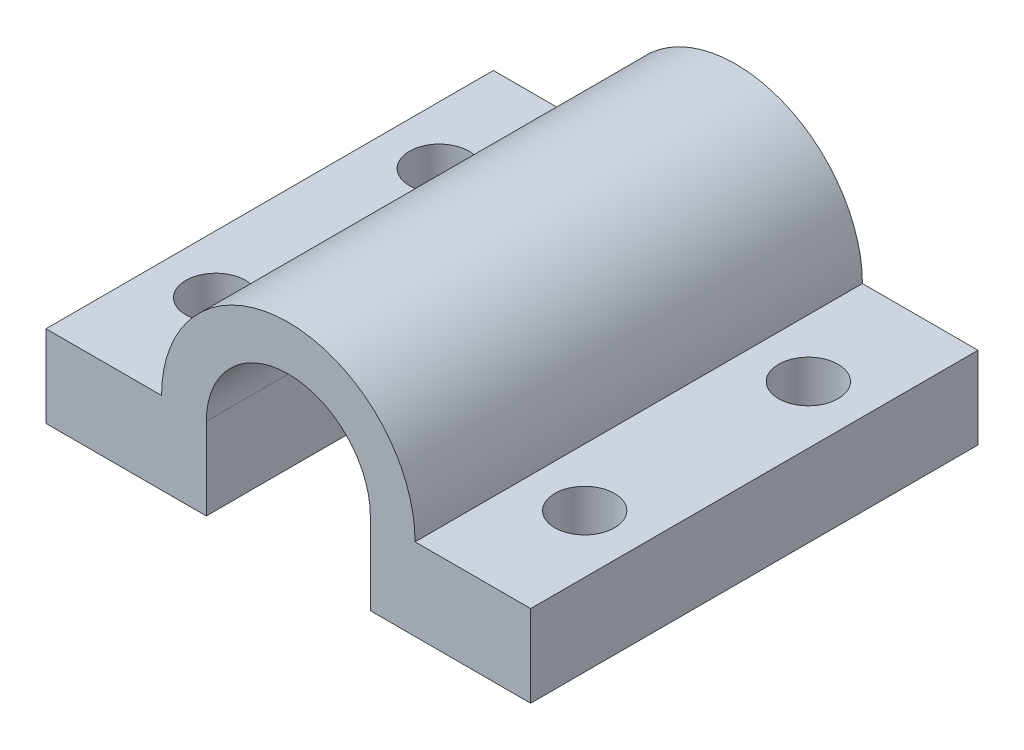
ISO-10303-21;
HEADER;
FILE_DESCRIPTION(('STEP AP214'),'2;1');
FILE_NAME('part.step','',(''),(''),'','','');
FILE_SCHEMA(('AUTOMOTIVE_DESIGN { 1 0 10303 214 1 1 1 1 }'));
ENDSEC;
DATA;
#1=APPLICATION_CONTEXT('core data for automotive mechanical design processes');
#2=APPLICATION_PROTOCOL_DEFINITION('international standard','automotive_design',2000,#1);
#3=PRODUCT_CONTEXT('',#1,'mechanical');
#4=PRODUCT('Part','Part','',(#3));
#5=PRODUCT_RELATED_PRODUCT_CATEGORY('part','',(#4));
#6=PRODUCT_DEFINITION_FORMATION('','',#4);
#7=PRODUCT_DEFINITION_CONTEXT('part definition',#1,'design');
#8=PRODUCT_DEFINITION('design','',#6,#7);
#9=PRODUCT_DEFINITION_SHAPE('','',#8);
#10=(LENGTH_UNIT() NAMED_UNIT(*) SI_UNIT(.MILLI.,.METRE.));
#11=(NAMED_UNIT(*) PLANE_ANGLE_UNIT() SI_UNIT($,.RADIAN.));
#12=(NAMED_UNIT(*) SI_UNIT($,.STERADIAN.) SOLID_ANGLE_UNIT());
#13=UNCERTAINTY_MEASURE_WITH_UNIT(LENGTH_MEASURE(1.E-05),#10,'distance_accuracy_value','');
#14=(GEOMETRIC_REPRESENTATION_CONTEXT(3) GLOBAL_UNCERTAINTY_ASSIGNED_CONTEXT((#13)) GLOBAL_UNIT_ASSIGNED_CONTEXT((#10,
#11,#12)) REPRESENTATION_CONTEXT('',''));
#15=CARTESIAN_POINT('',(0.,0.,0.));
#16=DIRECTION('',(0.,0.,1.));
#17=DIRECTION('',(1.,0.,0.));
#18=AXIS2_PLACEMENT_3D('',#15,#16,#17);
#19=CARTESIAN_POINT('',(0.,0.,12.));
#20=DIRECTION('',(0.,0.,-1.));
#21=DIRECTION('',(-1.,0.,0.));
#22=AXIS2_PLACEMENT_3D('',#19,#20,#21);
#23=CYLINDRICAL_SURFACE('',#22,2.2);
#24=CARTESIAN_POINT('',(0.,0.,0.));
#25=DIRECTION('',(0.,0.,-1.));
#26=DIRECTION('',(-1.,0.,0.));
#27=AXIS2_PLACEMENT_3D('',#24,#25,#26);
#28=CIRCLE('',#27,2.2);
#29=CARTESIAN_POINT('',(-2.2,0.,0.));
#30=VERTEX_POINT('',#29);
#31=CARTESIAN_POINT('',(2.2,0.,0.));
#32=VERTEX_POINT('',#31);
#33=EDGE_CURVE('E143',#30,#32,#28,.T.);
#34=ORIENTED_EDGE('',*,*,#33,.T.);
#35=DIRECTION('',(0.,0.,-1.));
#36=VECTOR('',#35,1.);
#37=CARTESIAN_POINT('',(2.2,0.,12.));
#38=LINE('',#37,#36);
#39=CARTESIAN_POINT('',(2.2,0.,12.));
#40=VERTEX_POINT('',#39);
#41=EDGE_CURVE('E11',#40,#32,#38,.T.);
#42=ORIENTED_EDGE('',*,*,#41,.F.);
#43=CARTESIAN_POINT('',(0.,0.,12.));
#44=DIRECTION('',(0.,0.,-1.));
#45=DIRECTION('',(-1.,0.,0.));
#46=AXIS2_PLACEMENT_3D('',#43,#44,#45);
#47=CIRCLE('',#46,2.2);
#48=CARTESIAN_POINT('',(-2.2,0.,12.));
#49=VERTEX_POINT('',#48);
#50=EDGE_CURVE('E162',#49,#40,#47,.T.);
#51=ORIENTED_EDGE('',*,*,#50,.F.);
#52=DIRECTION('',(0.,0.,-1.));
#53=VECTOR('',#52,1.);
#54=CARTESIAN_POINT('',(-2.2,0.,12.));
#55=LINE('',#54,#53);
#56=EDGE_CURVE('E139',#49,#30,#55,.T.);
#57=ORIENTED_EDGE('',*,*,#56,.T.);
#58=EDGE_LOOP('',(#34,#42,#51,#57));
#59=FACE_BOUND('',#58,.T.);
#60=ADVANCED_FACE('F33',(#59),#23,.F.);
#61=CARTESIAN_POINT('',(2.2,0.,12.));
#62=DIRECTION('',(1.,0.,0.));
#63=DIRECTION('',(0.,1.,0.));
#64=AXIS2_PLACEMENT_3D('',#61,#62,#63);
#65=PLANE('',#64);
#66=DIRECTION('',(0.,-1.,0.));
#67=VECTOR('',#66,1.);
#68=CARTESIAN_POINT('',(2.2,0.,0.));
#69=LINE('',#68,#67);
#70=CARTESIAN_POINT('',(2.2,-2.2,0.));
#71=VERTEX_POINT('',#70);
#72=EDGE_CURVE('E146',#32,#71,#69,.T.);
#73=ORIENTED_EDGE('',*,*,#72,.T.);
#74=DIRECTION('',(0.,0.,-1.));
#75=VECTOR('',#74,1.);
#76=CARTESIAN_POINT('',(2.2,-2.2,12.));
#77=LINE('',#76,#75);
#78=CARTESIAN_POINT('',(2.2,-2.2,12.));
#79=VERTEX_POINT('',#78);
#80=EDGE_CURVE('E42',#79,#71,#77,.T.);
#81=ORIENTED_EDGE('',*,*,#80,.F.);
#82=DIRECTION('',(0.,-1.,0.));
#83=VECTOR('',#82,1.);
#84=CARTESIAN_POINT('',(2.2,0.,12.));
#85=LINE('',#84,#83);
#86=EDGE_CURVE('E100',#40,#79,#85,.T.);
#87=ORIENTED_EDGE('',*,*,#86,.F.);
#88=ORIENTED_EDGE('',*,*,#41,.T.);
#89=EDGE_LOOP('',(#73,#81,#87,#88));
#90=FACE_BOUND('',#89,.T.);
#91=ADVANCED_FACE('F238',(#90),#65,.F.);
#92=CARTESIAN_POINT('',(2.2,-2.2,12.));
#93=DIRECTION('',(0.,1.,0.));
#94=DIRECTION('',(-1.,0.,0.));
#95=AXIS2_PLACEMENT_3D('',#92,#93,#94);
#96=PLANE('',#95);
#97=CARTESIAN_POINT('',(4.95,-2.19999999999999,3.));
#98=DIRECTION('',(0.,1.,0.));
#99=DIRECTION('',(-1.,0.,0.));
#100=AXIS2_PLACEMENT_3D('',#97,#98,#99);
#101=CIRCLE('',#100,0.800000000000001);
#102=CARTESIAN_POINT('',(4.15,-2.2,3.));
#103=VERTEX_POINT('',#102);
#104=EDGE_CURVE('E147',#103,#103,#101,.T.);
#105=ORIENTED_EDGE('',*,*,#104,.T.);
#106=EDGE_LOOP('',(#105));
#107=FACE_BOUND('',#106,.T.);
#108=CARTESIAN_POINT('',(4.95,-2.19999999999999,9.));
#109=DIRECTION('',(0.,1.,0.));
#110=DIRECTION('',(-1.,0.,0.));
#111=AXIS2_PLACEMENT_3D('',#108,#109,#110);
#112=CIRCLE('',#111,0.800000000000001);
#113=CARTESIAN_POINT('',(4.15,-2.2,9.));
#114=VERTEX_POINT('',#113);
#115=EDGE_CURVE('E185',#114,#114,#112,.T.);
#116=ORIENTED_EDGE('',*,*,#115,.T.);
#117=EDGE_LOOP('',(#116));
#118=FACE_BOUND('',#117,.T.);
#119=DIRECTION('',(1.,0.,0.));
#120=VECTOR('',#119,1.);
#121=CARTESIAN_POINT('',(2.2,-2.2,0.));
#122=LINE('',#121,#120);
#123=CARTESIAN_POINT('',(6.50000000000001,-2.19999999999999,0.));
#124=VERTEX_POINT('',#123);
#125=EDGE_CURVE('E149',#71,#124,#122,.T.);
#126=ORIENTED_EDGE('',*,*,#125,.T.);
#127=DIRECTION('',(0.,0.,-1.));
#128=VECTOR('',#127,1.);
#129=CARTESIAN_POINT('',(6.50000000000001,-2.19999999999999,12.));
#130=LINE('',#129,#128);
#131=CARTESIAN_POINT('',(6.50000000000001,-2.19999999999999,12.));
#132=VERTEX_POINT('',#131);
#133=EDGE_CURVE('E175',#132,#124,#130,.T.);
#134=ORIENTED_EDGE('',*,*,#133,.F.);
#135=DIRECTION('',(1.,0.,0.));
#136=VECTOR('',#135,1.);
#137=CARTESIAN_POINT('',(2.2,-2.2,12.));
#138=LINE('',#137,#136);
#139=EDGE_CURVE('E202',#79,#132,#138,.T.);
#140=ORIENTED_EDGE('',*,*,#139,.F.);
#141=ORIENTED_EDGE('',*,*,#80,.T.);
#142=EDGE_LOOP('',(#126,#134,#140,#141));
#143=FACE_BOUND('',#142,.T.);
#144=ADVANCED_FACE('F242',(#107,#118,#143),#96,.F.);
#145=CARTESIAN_POINT('',(6.50000000000001,-2.19999999999999,12.));
#146=DIRECTION('',(-1.,0.,0.));
#147=DIRECTION('',(0.,0.,1.));
#148=AXIS2_PLACEMENT_3D('',#145,#146,#147);
#149=PLANE('',#148);
#150=DIRECTION('',(0.,1.,0.));
#151=VECTOR('',#150,1.);
#152=CARTESIAN_POINT('',(6.50000000000001,-2.19999999999999,0.));
#153=LINE('',#152,#151);
#154=CARTESIAN_POINT('',(6.50000000000001,0.,0.));
#155=VERTEX_POINT('',#154);
#156=EDGE_CURVE('E151',#124,#155,#153,.T.);
#157=ORIENTED_EDGE('',*,*,#156,.T.);
#158=DIRECTION('',(0.,0.,-1.));
#159=VECTOR('',#158,1.);
#160=CARTESIAN_POINT('',(6.50000000000001,0.,12.));
#161=LINE('',#160,#159);
#162=CARTESIAN_POINT('',(6.50000000000001,0.,12.));
#163=VERTEX_POINT('',#162);
#164=EDGE_CURVE('E172',#163,#155,#161,.T.);
#165=ORIENTED_EDGE('',*,*,#164,.F.);
#166=DIRECTION('',(0.,1.,0.));
#167=VECTOR('',#166,1.);
#168=CARTESIAN_POINT('',(6.50000000000001,-2.19999999999999,12.));
#169=LINE('',#168,#167);
#170=EDGE_CURVE('E204',#132,#163,#169,.T.);
#171=ORIENTED_EDGE('',*,*,#170,.F.);
#172=ORIENTED_EDGE('',*,*,#133,.T.);
#173=EDGE_LOOP('',(#157,#165,#171,#172));
#174=FACE_BOUND('',#173,.T.);
#175=ADVANCED_FACE('F246',(#174),#149,.F.);
#176=CARTESIAN_POINT('',(6.50000000000001,0.,12.));
#177=DIRECTION('',(0.,-1.,0.));
#178=DIRECTION('',(1.,0.,0.));
#179=AXIS2_PLACEMENT_3D('',#176,#177,#178);
#180=PLANE('',#179);
#181=CARTESIAN_POINT('',(4.95,0.,3.));
#182=DIRECTION('',(0.,1.,0.));
#183=DIRECTION('',(0.,0.,-1.));
#184=AXIS2_PLACEMENT_3D('',#181,#182,#183);
#185=CIRCLE('',#184,0.800000000000001);
#186=CARTESIAN_POINT('',(4.95,0.,2.2));
#187=VERTEX_POINT('',#186);
#188=EDGE_CURVE('E192',#187,#187,#185,.T.);
#189=ORIENTED_EDGE('',*,*,#188,.F.);
#190=EDGE_LOOP('',(#189));
#191=FACE_BOUND('',#190,.T.);
#192=CARTESIAN_POINT('',(4.95,0.,9.));
#193=DIRECTION('',(0.,1.,0.));
#194=DIRECTION('',(0.,0.,1.));
#195=AXIS2_PLACEMENT_3D('',#192,#193,#194);
#196=CIRCLE('',#195,0.800000000000001);
#197=CARTESIAN_POINT('',(4.95,0.,9.8));
#198=VERTEX_POINT('',#197);
#199=EDGE_CURVE('E384',#198,#198,#196,.T.);
#200=ORIENTED_EDGE('',*,*,#199,.F.);
#201=EDGE_LOOP('',(#200));
#202=FACE_BOUND('',#201,.T.);
#203=DIRECTION('',(-1.,0.,0.));
#204=VECTOR('',#203,1.);
#205=CARTESIAN_POINT('',(6.50000000000001,0.,0.));
#206=LINE('',#205,#204);
#207=CARTESIAN_POINT('',(3.40000000000001,0.,0.));
#208=VERTEX_POINT('',#207);
#209=EDGE_CURVE('E153',#155,#208,#206,.T.);
#210=ORIENTED_EDGE('',*,*,#209,.T.);
#211=DIRECTION('',(0.,0.,-1.));
#212=VECTOR('',#211,1.);
#213=CARTESIAN_POINT('',(3.40000000000001,0.,12.));
#214=LINE('',#213,#212);
#215=CARTESIAN_POINT('',(3.40000000000001,0.,12.));
#216=VERTEX_POINT('',#215);
#217=EDGE_CURVE('E169',#216,#208,#214,.T.);
#218=ORIENTED_EDGE('',*,*,#217,.F.);
#219=DIRECTION('',(-1.,0.,0.));
#220=VECTOR('',#219,1.);
#221=CARTESIAN_POINT('',(6.50000000000001,0.,12.));
#222=LINE('',#221,#220);
#223=EDGE_CURVE('E206',#163,#216,#222,.T.);
#224=ORIENTED_EDGE('',*,*,#223,.F.);
#225=ORIENTED_EDGE('',*,*,#164,.T.);
#226=EDGE_LOOP('',(#210,#218,#224,#225));
#227=FACE_BOUND('',#226,.T.);
#228=ADVANCED_FACE('F252',(#191,#202,#227),#180,.F.);
#229=CARTESIAN_POINT('',(0.,0.,12.));
#230=DIRECTION('',(0.,0.,-1.));
#231=DIRECTION('',(-1.,0.,0.));
#232=AXIS2_PLACEMENT_3D('',#229,#230,#231);
#233=CYLINDRICAL_SURFACE('',#232,3.40000000000001);
#234=CARTESIAN_POINT('',(0.,0.,0.));
#235=DIRECTION('',(0.,0.,1.));
#236=DIRECTION('',(-1.,0.,0.));
#237=AXIS2_PLACEMENT_3D('',#234,#235,#236);
#238=CIRCLE('',#237,3.40000000000001);
#239=CARTESIAN_POINT('',(-3.4,0.,0.));
#240=VERTEX_POINT('',#239);
#241=EDGE_CURVE('E155',#208,#240,#238,.T.);
#242=ORIENTED_EDGE('',*,*,#241,.T.);
#243=DIRECTION('',(0.,0.,-1.));
#244=VECTOR('',#243,1.);
#245=CARTESIAN_POINT('',(-3.4,0.,12.));
#246=LINE('',#245,#244);
#247=CARTESIAN_POINT('',(-3.4,0.,12.));
#248=VERTEX_POINT('',#247);
#249=EDGE_CURVE('E166',#248,#240,#246,.T.);
#250=ORIENTED_EDGE('',*,*,#249,.F.);
#251=CARTESIAN_POINT('',(0.,0.,12.));
#252=DIRECTION('',(0.,0.,1.));
#253=DIRECTION('',(-1.,0.,0.));
#254=AXIS2_PLACEMENT_3D('',#251,#252,#253);
#255=CIRCLE('',#254,3.40000000000001);
#256=EDGE_CURVE('E208',#216,#248,#255,.T.);
#257=ORIENTED_EDGE('',*,*,#256,.F.);
#258=ORIENTED_EDGE('',*,*,#217,.T.);
#259=EDGE_LOOP('',(#242,#250,#257,#258));
#260=FACE_BOUND('',#259,.T.);
#261=ADVANCED_FACE('F214',(#260),#233,.T.);
#262=CARTESIAN_POINT('',(-6.49999999999999,0.,12.));
#263=DIRECTION('',(0.,-1.,0.));
#264=DIRECTION('',(0.,0.,-1.));
#265=AXIS2_PLACEMENT_3D('',#262,#263,#264);
#266=PLANE('',#265);
#267=CARTESIAN_POINT('',(-4.95,0.,9.));
#268=DIRECTION('',(0.,1.,0.));
#269=DIRECTION('',(0.,0.,-1.));
#270=AXIS2_PLACEMENT_3D('',#267,#268,#269);
#271=CIRCLE('',#270,0.800000000000001);
#272=CARTESIAN_POINT('',(-4.95,0.,8.2));
#273=VERTEX_POINT('',#272);
#274=EDGE_CURVE('E187',#273,#273,#271,.T.);
#275=ORIENTED_EDGE('',*,*,#274,.F.);
#276=EDGE_LOOP('',(#275));
#277=FACE_BOUND('',#276,.T.);
#278=CARTESIAN_POINT('',(-4.95,0.,3.));
#279=DIRECTION('',(0.,1.,0.));
#280=DIRECTION('',(0.,0.,1.));
#281=AXIS2_PLACEMENT_3D('',#278,#279,#280);
#282=CIRCLE('',#281,0.800000000000001);
#283=CARTESIAN_POINT('',(-4.95,0.,3.8));
#284=VERTEX_POINT('',#283);
#285=EDGE_CURVE('E181',#284,#284,#282,.T.);
#286=ORIENTED_EDGE('',*,*,#285,.F.);
#287=EDGE_LOOP('',(#286));
#288=FACE_BOUND('',#287,.T.);
#289=DIRECTION('',(-1.,0.,0.));
#290=VECTOR('',#289,1.);
#291=CARTESIAN_POINT('',(-6.49999999999999,0.,0.));
#292=LINE('',#291,#290);
#293=CARTESIAN_POINT('',(-6.49999999999999,0.,0.));
#294=VERTEX_POINT('',#293);
#295=EDGE_CURVE('E157',#240,#294,#292,.T.);
#296=ORIENTED_EDGE('',*,*,#295,.T.);
#297=DIRECTION('',(0.,0.,-1.));
#298=VECTOR('',#297,1.);
#299=CARTESIAN_POINT('',(-6.49999999999999,0.,12.));
#300=LINE('',#299,#298);
#301=CARTESIAN_POINT('',(-6.49999999999999,0.,12.));
#302=VERTEX_POINT('',#301);
#303=EDGE_CURVE('E134',#302,#294,#300,.T.);
#304=ORIENTED_EDGE('',*,*,#303,.F.);
#305=DIRECTION('',(-1.,0.,0.));
#306=VECTOR('',#305,1.);
#307=CARTESIAN_POINT('',(-6.49999999999999,0.,12.));
#308=LINE('',#307,#306);
#309=EDGE_CURVE('E125',#248,#302,#308,.T.);
#310=ORIENTED_EDGE('',*,*,#309,.F.);
#311=ORIENTED_EDGE('',*,*,#249,.T.);
#312=EDGE_LOOP('',(#296,#304,#310,#311));
#313=FACE_BOUND('',#312,.T.);
#314=ADVANCED_FACE('F218',(#277,#288,#313),#266,.F.);
#315=CARTESIAN_POINT('',(-6.49999999999999,-2.19999999999999,12.));
#316=DIRECTION('',(1.,0.,0.));
#317=DIRECTION('',(0.,0.,-1.));
#318=AXIS2_PLACEMENT_3D('',#315,#316,#317);
#319=PLANE('',#318);
#320=DIRECTION('',(0.,-1.,0.));
#321=VECTOR('',#320,1.);
#322=CARTESIAN_POINT('',(-6.49999999999999,-2.19999999999999,0.));
#323=LINE('',#322,#321);
#324=CARTESIAN_POINT('',(-6.49999999999999,-2.19999999999999,0.));
#325=VERTEX_POINT('',#324);
#326=EDGE_CURVE('E133',#294,#325,#323,.T.);
#327=ORIENTED_EDGE('',*,*,#326,.T.);
#328=DIRECTION('',(0.,0.,-1.));
#329=VECTOR('',#328,1.);
#330=CARTESIAN_POINT('',(-6.49999999999999,-2.19999999999999,12.));
#331=LINE('',#330,#329);
#332=CARTESIAN_POINT('',(-6.49999999999999,-2.19999999999999,12.));
#333=VERTEX_POINT('',#332);
#334=EDGE_CURVE('E130',#333,#325,#331,.T.);
#335=ORIENTED_EDGE('',*,*,#334,.F.);
#336=DIRECTION('',(0.,-1.,0.));
#337=VECTOR('',#336,1.);
#338=CARTESIAN_POINT('',(-6.49999999999999,-2.19999999999999,12.));
#339=LINE('',#338,#337);
#340=EDGE_CURVE('E119',#302,#333,#339,.T.);
#341=ORIENTED_EDGE('',*,*,#340,.F.);
#342=ORIENTED_EDGE('',*,*,#303,.T.);
#343=EDGE_LOOP('',(#327,#335,#341,#342));
#344=FACE_BOUND('',#343,.T.);
#345=ADVANCED_FACE('F131',(#344),#319,.F.);
#346=CARTESIAN_POINT('',(-2.2,-2.2,12.));
#347=DIRECTION('',(0.,1.,0.));
#348=DIRECTION('',(-1.,0.,0.));
#349=AXIS2_PLACEMENT_3D('',#346,#347,#348);
#350=PLANE('',#349);
#351=CARTESIAN_POINT('',(-4.95,-2.2,9.));
#352=DIRECTION('',(0.,1.,0.));
#353=DIRECTION('',(-1.,0.,0.));
#354=AXIS2_PLACEMENT_3D('',#351,#352,#353);
#355=CIRCLE('',#354,0.800000000000001);
#356=CARTESIAN_POINT('',(-5.75,-2.2,9.));
#357=VERTEX_POINT('',#356);
#358=EDGE_CURVE('E36',#357,#357,#355,.T.);
#359=ORIENTED_EDGE('',*,*,#358,.T.);
#360=EDGE_LOOP('',(#359));
#361=FACE_BOUND('',#360,.T.);
#362=CARTESIAN_POINT('',(-4.95,-2.2,3.));
#363=DIRECTION('',(0.,1.,0.));
#364=DIRECTION('',(-1.,0.,0.));
#365=AXIS2_PLACEMENT_3D('',#362,#363,#364);
#366=CIRCLE('',#365,0.800000000000001);
#367=CARTESIAN_POINT('',(-5.75,-2.2,3.));
#368=VERTEX_POINT('',#367);
#369=EDGE_CURVE('E179',#368,#368,#366,.T.);
#370=ORIENTED_EDGE('',*,*,#369,.T.);
#371=EDGE_LOOP('',(#370));
#372=FACE_BOUND('',#371,.T.);
#373=DIRECTION('',(1.,0.,0.));
#374=VECTOR('',#373,1.);
#375=CARTESIAN_POINT('',(-2.2,-2.2,0.));
#376=LINE('',#375,#374);
#377=CARTESIAN_POINT('',(-2.2,-2.2,0.));
#378=VERTEX_POINT('',#377);
#379=EDGE_CURVE('E86',#325,#378,#376,.T.);
#380=ORIENTED_EDGE('',*,*,#379,.T.);
#381=DIRECTION('',(0.,0.,-1.));
#382=VECTOR('',#381,1.);
#383=CARTESIAN_POINT('',(-2.2,-2.2,12.));
#384=LINE('',#383,#382);
#385=CARTESIAN_POINT('',(-2.2,-2.2,12.));
#386=VERTEX_POINT('',#385);
#387=EDGE_CURVE('E135',#386,#378,#384,.T.);
#388=ORIENTED_EDGE('',*,*,#387,.F.);
#389=DIRECTION('',(1.,0.,0.));
#390=VECTOR('',#389,1.);
#391=CARTESIAN_POINT('',(-2.2,-2.2,12.));
#392=LINE('',#391,#390);
#393=EDGE_CURVE('E123',#333,#386,#392,.T.);
#394=ORIENTED_EDGE('',*,*,#393,.F.);
#395=ORIENTED_EDGE('',*,*,#334,.T.);
#396=EDGE_LOOP('',(#380,#388,#394,#395));
#397=FACE_BOUND('',#396,.T.);
#398=ADVANCED_FACE('F137',(#361,#372,#397),#350,.F.);
#399=CARTESIAN_POINT('',(-2.2,0.,12.));
#400=DIRECTION('',(-1.,0.,0.));
#401=DIRECTION('',(0.,-1.,0.));
#402=AXIS2_PLACEMENT_3D('',#399,#400,#401);
#403=PLANE('',#402);
#404=DIRECTION('',(0.,1.,0.));
#405=VECTOR('',#404,1.);
#406=CARTESIAN_POINT('',(-2.2,0.,0.));
#407=LINE('',#406,#405);
#408=EDGE_CURVE('E92',#378,#30,#407,.T.);
#409=ORIENTED_EDGE('',*,*,#408,.T.);
#410=ORIENTED_EDGE('',*,*,#56,.F.);
#411=DIRECTION('',(0.,1.,0.));
#412=VECTOR('',#411,1.);
#413=CARTESIAN_POINT('',(-2.2,0.,12.));
#414=LINE('',#413,#412);
#415=EDGE_CURVE('E51',#386,#49,#414,.T.);
#416=ORIENTED_EDGE('',*,*,#415,.F.);
#417=ORIENTED_EDGE('',*,*,#387,.T.);
#418=EDGE_LOOP('',(#409,#410,#416,#417));
#419=FACE_BOUND('',#418,.T.);
#420=ADVANCED_FACE('F226',(#419),#403,.F.);
#421=CARTESIAN_POINT('',(0.,0.,12.));
#422=DIRECTION('',(0.,0.,-1.));
#423=DIRECTION('',(-1.,0.,0.));
#424=AXIS2_PLACEMENT_3D('',#421,#422,#423);
#425=PLANE('',#424);
#426=ORIENTED_EDGE('',*,*,#50,.T.);
#427=ORIENTED_EDGE('',*,*,#86,.T.);
#428=ORIENTED_EDGE('',*,*,#139,.T.);
#429=ORIENTED_EDGE('',*,*,#170,.T.);
#430=ORIENTED_EDGE('',*,*,#223,.T.);
#431=ORIENTED_EDGE('',*,*,#256,.T.);
#432=ORIENTED_EDGE('',*,*,#309,.T.);
#433=ORIENTED_EDGE('',*,*,#340,.T.);
#434=ORIENTED_EDGE('',*,*,#393,.T.);
#435=ORIENTED_EDGE('',*,*,#415,.T.);
#436=EDGE_LOOP('',(#426,#427,#428,#429,#430,#431,#432,#433,#434,#435));
#437=FACE_BOUND('',#436,.T.);
#438=ADVANCED_FACE('F121',(#437),#425,.F.);
#439=CARTESIAN_POINT('',(0.,0.,0.));
#440=DIRECTION('',(0.,0.,-1.));
#441=DIRECTION('',(-1.,0.,0.));
#442=AXIS2_PLACEMENT_3D('',#439,#440,#441);
#443=PLANE('',#442);
#444=ORIENTED_EDGE('',*,*,#33,.F.);
#445=ORIENTED_EDGE('',*,*,#408,.F.);
#446=ORIENTED_EDGE('',*,*,#379,.F.);
#447=ORIENTED_EDGE('',*,*,#326,.F.);
#448=ORIENTED_EDGE('',*,*,#295,.F.);
#449=ORIENTED_EDGE('',*,*,#241,.F.);
#450=ORIENTED_EDGE('',*,*,#209,.F.);
#451=ORIENTED_EDGE('',*,*,#156,.F.);
#452=ORIENTED_EDGE('',*,*,#125,.F.);
#453=ORIENTED_EDGE('',*,*,#72,.F.);
#454=EDGE_LOOP('',(#444,#445,#446,#447,#448,#449,#450,#451,#452,#453));
#455=FACE_BOUND('',#454,.T.);
#456=ADVANCED_FACE('F221',(#455),#443,.T.);
#457=CARTESIAN_POINT('',(-4.95,-20.,3.));
#458=DIRECTION('',(0.,1.,0.));
#459=DIRECTION('',(0.,0.,1.));
#460=AXIS2_PLACEMENT_3D('',#457,#458,#459);
#461=CYLINDRICAL_SURFACE('',#460,0.800000000000001);
#462=ORIENTED_EDGE('',*,*,#285,.T.);
#463=EDGE_LOOP('',(#462));
#464=FACE_BOUND('',#463,.T.);
#465=ORIENTED_EDGE('',*,*,#369,.F.);
#466=EDGE_LOOP('',(#465));
#467=FACE_BOUND('',#466,.T.);
#468=ADVANCED_FACE('F281',(#464,#467),#461,.F.);
#469=CARTESIAN_POINT('',(-4.95,-20.,9.));
#470=DIRECTION('',(0.,1.,0.));
#471=DIRECTION('',(0.,0.,1.));
#472=AXIS2_PLACEMENT_3D('',#469,#470,#471);
#473=CYLINDRICAL_SURFACE('',#472,0.800000000000001);
#474=ORIENTED_EDGE('',*,*,#274,.T.);
#475=EDGE_LOOP('',(#474));
#476=FACE_BOUND('',#475,.T.);
#477=ORIENTED_EDGE('',*,*,#358,.F.);
#478=EDGE_LOOP('',(#477));
#479=FACE_BOUND('',#478,.T.);
#480=ADVANCED_FACE('F286',(#476,#479),#473,.F.);
#481=CARTESIAN_POINT('',(4.95,-20.,9.));
#482=DIRECTION('',(0.,1.,0.));
#483=DIRECTION('',(0.,0.,1.));
#484=AXIS2_PLACEMENT_3D('',#481,#482,#483);
#485=CYLINDRICAL_SURFACE('',#484,0.800000000000001);
#486=ORIENTED_EDGE('',*,*,#199,.T.);
#487=EDGE_LOOP('',(#486));
#488=FACE_BOUND('',#487,.T.);
#489=ORIENTED_EDGE('',*,*,#115,.F.);
#490=EDGE_LOOP('',(#489));
#491=FACE_BOUND('',#490,.T.);
#492=ADVANCED_FACE('F297',(#488,#491),#485,.F.);
#493=CARTESIAN_POINT('',(4.95,-20.,3.));
#494=DIRECTION('',(0.,1.,0.));
#495=DIRECTION('',(0.,0.,1.));
#496=AXIS2_PLACEMENT_3D('',#493,#494,#495);
#497=CYLINDRICAL_SURFACE('',#496,0.800000000000001);
#498=ORIENTED_EDGE('',*,*,#188,.T.);
#499=EDGE_LOOP('',(#498));
#500=FACE_BOUND('',#499,.T.);
#501=ORIENTED_EDGE('',*,*,#104,.F.);
#502=EDGE_LOOP('',(#501));
#503=FACE_BOUND('',#502,.T.);
#504=ADVANCED_FACE('F307',(#500,#503),#497,.F.);
#505=CLOSED_SHELL('',(#60,#91,#144,#175,#228,#261,#314,#345,#398,#420,#438,#456,#468,#480,#492,#504));
#506=MANIFOLD_SOLID_BREP('B2',#505);
#507=ADVANCED_BREP_SHAPE_REPRESENTATION('',(#18,#506),#14);
#508=SHAPE_DEFINITION_REPRESENTATION(#9,#507);
ENDSEC;
END-ISO-10303-21;
